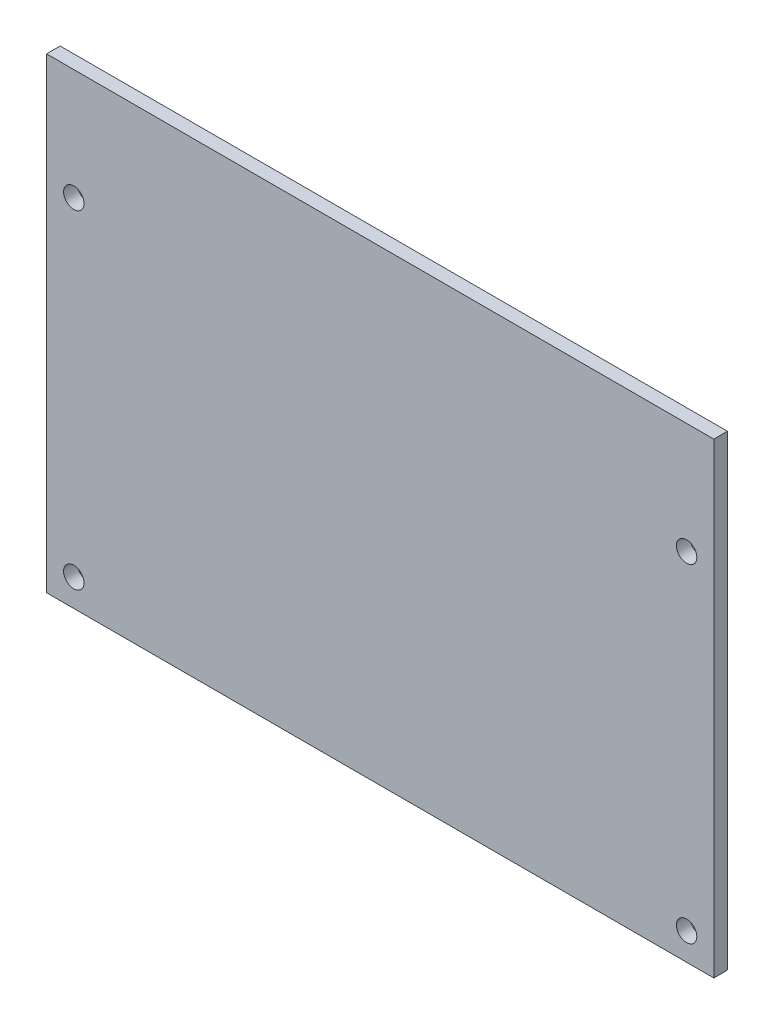
ISO-10303-21;
HEADER;
FILE_DESCRIPTION(('STEP AP214'),'2;1');
FILE_NAME('part.step','',(''),(''),'','','');
FILE_SCHEMA(('AUTOMOTIVE_DESIGN { 1 0 10303 214 1 1 1 1 }'));
ENDSEC;
DATA;
#1=APPLICATION_CONTEXT('core data for automotive mechanical design processes');
#2=APPLICATION_PROTOCOL_DEFINITION('international standard','automotive_design',2000,#1);
#3=PRODUCT_CONTEXT('',#1,'mechanical');
#4=PRODUCT('Part','Part','',(#3));
#5=PRODUCT_RELATED_PRODUCT_CATEGORY('part','',(#4));
#6=PRODUCT_DEFINITION_FORMATION('','',#4);
#7=PRODUCT_DEFINITION_CONTEXT('part definition',#1,'design');
#8=PRODUCT_DEFINITION('design','',#6,#7);
#9=PRODUCT_DEFINITION_SHAPE('','',#8);
#10=(LENGTH_UNIT() NAMED_UNIT(*) SI_UNIT(.MILLI.,.METRE.));
#11=(NAMED_UNIT(*) PLANE_ANGLE_UNIT() SI_UNIT($,.RADIAN.));
#12=(NAMED_UNIT(*) SI_UNIT($,.STERADIAN.) SOLID_ANGLE_UNIT());
#13=UNCERTAINTY_MEASURE_WITH_UNIT(LENGTH_MEASURE(1.E-05),#10,'distance_accuracy_value','');
#14=(GEOMETRIC_REPRESENTATION_CONTEXT(3) GLOBAL_UNCERTAINTY_ASSIGNED_CONTEXT((#13)) GLOBAL_UNIT_ASSIGNED_CONTEXT((#10,
#11,#12)) REPRESENTATION_CONTEXT('',''));
#15=CARTESIAN_POINT('',(0.,0.,0.));
#16=DIRECTION('',(0.,0.,1.));
#17=DIRECTION('',(1.,0.,0.));
#18=AXIS2_PLACEMENT_3D('',#15,#16,#17);
#19=CARTESIAN_POINT('',(0.,0.,2.));
#20=DIRECTION('',(0.,0.,1.));
#21=DIRECTION('',(1.,0.,0.));
#22=AXIS2_PLACEMENT_3D('',#19,#20,#21);
#23=PLANE('',#22);
#24=CARTESIAN_POINT('',(32.7671798801061,-22.854174200445,2.));
#25=DIRECTION('',(0.,0.,1.));
#26=DIRECTION('',(1.,0.,0.));
#27=AXIS2_PLACEMENT_3D('',#24,#25,#26);
#28=CIRCLE('',#27,1.5);
#29=CARTESIAN_POINT('',(34.2671798801061,-22.854174200445,2.));
#30=VERTEX_POINT('',#29);
#31=EDGE_CURVE('E120',#30,#30,#28,.T.);
#32=ORIENTED_EDGE('',*,*,#31,.F.);
#33=EDGE_LOOP('',(#32));
#34=FACE_BOUND('',#33,.T.);
#35=CARTESIAN_POINT('',(-57.2328201198939,25.395825799555,2.));
#36=DIRECTION('',(0.,0.,1.));
#37=DIRECTION('',(1.,0.,0.));
#38=AXIS2_PLACEMENT_3D('',#35,#36,#37);
#39=CIRCLE('',#38,1.5);
#40=CARTESIAN_POINT('',(-55.7328201198939,25.395825799555,2.));
#41=VERTEX_POINT('',#40);
#42=EDGE_CURVE('E99',#41,#41,#39,.T.);
#43=ORIENTED_EDGE('',*,*,#42,.F.);
#44=EDGE_LOOP('',(#43));
#45=FACE_BOUND('',#44,.T.);
#46=DIRECTION('',(0.,1.,0.));
#47=VECTOR('',#46,1.);
#48=CARTESIAN_POINT('',(36.7671798801061,41.6881443298969,2.));
#49=LINE('',#48,#47);
#50=CARTESIAN_POINT('',(36.7671798801061,-26.854174200445,2.));
#51=VERTEX_POINT('',#50);
#52=CARTESIAN_POINT('',(36.7671798801061,41.6881443298969,2.));
#53=VERTEX_POINT('',#52);
#54=EDGE_CURVE('E84',#51,#53,#49,.T.);
#55=ORIENTED_EDGE('',*,*,#54,.T.);
#56=DIRECTION('',(-1.,0.,0.));
#57=VECTOR('',#56,1.);
#58=CARTESIAN_POINT('',(-61.2328201198939,41.6881443298969,2.));
#59=LINE('',#58,#57);
#60=CARTESIAN_POINT('',(-61.2328201198939,41.6881443298969,2.));
#61=VERTEX_POINT('',#60);
#62=EDGE_CURVE('E79',#53,#61,#59,.T.);
#63=ORIENTED_EDGE('',*,*,#62,.T.);
#64=DIRECTION('',(0.,-1.,0.));
#65=VECTOR('',#64,1.);
#66=CARTESIAN_POINT('',(-61.2328201198939,41.6881443298969,2.));
#67=LINE('',#66,#65);
#68=CARTESIAN_POINT('',(-61.2328201198939,-26.854174200445,2.));
#69=VERTEX_POINT('',#68);
#70=EDGE_CURVE('E82',#61,#69,#67,.T.);
#71=ORIENTED_EDGE('',*,*,#70,.T.);
#72=DIRECTION('',(1.,0.,0.));
#73=VECTOR('',#72,1.);
#74=CARTESIAN_POINT('',(-61.2328201198939,-26.854174200445,2.));
#75=LINE('',#74,#73);
#76=EDGE_CURVE('E49',#69,#51,#75,.T.);
#77=ORIENTED_EDGE('',*,*,#76,.T.);
#78=EDGE_LOOP('',(#55,#63,#71,#77));
#79=FACE_BOUND('',#78,.T.);
#80=CARTESIAN_POINT('',(-57.2328201198939,-22.854174200445,2.));
#81=DIRECTION('',(0.,0.,1.));
#82=DIRECTION('',(1.,0.,0.));
#83=AXIS2_PLACEMENT_3D('',#80,#81,#82);
#84=CIRCLE('',#83,1.5);
#85=CARTESIAN_POINT('',(-55.7328201198939,-22.854174200445,2.));
#86=VERTEX_POINT('',#85);
#87=EDGE_CURVE('E114',#86,#86,#84,.T.);
#88=ORIENTED_EDGE('',*,*,#87,.F.);
#89=EDGE_LOOP('',(#88));
#90=FACE_BOUND('',#89,.T.);
#91=CARTESIAN_POINT('',(32.7671798801061,25.3958257995551,2.));
#92=DIRECTION('',(0.,0.,1.));
#93=DIRECTION('',(1.,0.,0.));
#94=AXIS2_PLACEMENT_3D('',#91,#92,#93);
#95=CIRCLE('',#94,1.5);
#96=CARTESIAN_POINT('',(34.2671798801061,25.3958257995551,2.));
#97=VERTEX_POINT('',#96);
#98=EDGE_CURVE('E126',#97,#97,#95,.T.);
#99=ORIENTED_EDGE('',*,*,#98,.F.);
#100=EDGE_LOOP('',(#99));
#101=FACE_BOUND('',#100,.T.);
#102=ADVANCED_FACE('F32',(#34,#45,#79,#90,#101),#23,.T.);
#103=CARTESIAN_POINT('',(0.,0.,0.));
#104=DIRECTION('',(0.,0.,1.));
#105=DIRECTION('',(1.,0.,0.));
#106=AXIS2_PLACEMENT_3D('',#103,#104,#105);
#107=PLANE('',#106);
#108=DIRECTION('',(0.,1.,0.));
#109=VECTOR('',#108,1.);
#110=CARTESIAN_POINT('',(36.7671798801061,41.6881443298969,0.));
#111=LINE('',#110,#109);
#112=CARTESIAN_POINT('',(36.7671798801061,-26.854174200445,0.));
#113=VERTEX_POINT('',#112);
#114=CARTESIAN_POINT('',(36.7671798801061,41.6881443298969,0.));
#115=VERTEX_POINT('',#114);
#116=EDGE_CURVE('E96',#113,#115,#111,.T.);
#117=ORIENTED_EDGE('',*,*,#116,.F.);
#118=DIRECTION('',(1.,0.,0.));
#119=VECTOR('',#118,1.);
#120=CARTESIAN_POINT('',(-61.2328201198939,-26.854174200445,0.));
#121=LINE('',#120,#119);
#122=CARTESIAN_POINT('',(-61.2328201198939,-26.854174200445,0.));
#123=VERTEX_POINT('',#122);
#124=EDGE_CURVE('E72',#123,#113,#121,.T.);
#125=ORIENTED_EDGE('',*,*,#124,.F.);
#126=DIRECTION('',(0.,-1.,0.));
#127=VECTOR('',#126,1.);
#128=CARTESIAN_POINT('',(-61.2328201198939,41.6881443298969,0.));
#129=LINE('',#128,#127);
#130=CARTESIAN_POINT('',(-61.2328201198939,41.6881443298969,0.));
#131=VERTEX_POINT('',#130);
#132=EDGE_CURVE('E66',#131,#123,#129,.T.);
#133=ORIENTED_EDGE('',*,*,#132,.F.);
#134=DIRECTION('',(-1.,0.,0.));
#135=VECTOR('',#134,1.);
#136=CARTESIAN_POINT('',(-61.2328201198939,41.6881443298969,0.));
#137=LINE('',#136,#135);
#138=EDGE_CURVE('E88',#115,#131,#137,.T.);
#139=ORIENTED_EDGE('',*,*,#138,.F.);
#140=EDGE_LOOP('',(#117,#125,#133,#139));
#141=FACE_BOUND('',#140,.T.);
#142=CARTESIAN_POINT('',(-57.2328201198939,25.395825799555,0.));
#143=DIRECTION('',(0.,0.,1.));
#144=DIRECTION('',(1.,0.,0.));
#145=AXIS2_PLACEMENT_3D('',#142,#143,#144);
#146=CIRCLE('',#145,1.5);
#147=CARTESIAN_POINT('',(-55.7328201198939,25.395825799555,0.));
#148=VERTEX_POINT('',#147);
#149=EDGE_CURVE('E111',#148,#148,#146,.T.);
#150=ORIENTED_EDGE('',*,*,#149,.T.);
#151=EDGE_LOOP('',(#150));
#152=FACE_BOUND('',#151,.T.);
#153=CARTESIAN_POINT('',(-57.2328201198939,-22.854174200445,0.));
#154=DIRECTION('',(0.,0.,1.));
#155=DIRECTION('',(1.,0.,0.));
#156=AXIS2_PLACEMENT_3D('',#153,#154,#155);
#157=CIRCLE('',#156,1.5);
#158=CARTESIAN_POINT('',(-55.7328201198939,-22.854174200445,0.));
#159=VERTEX_POINT('',#158);
#160=EDGE_CURVE('E117',#159,#159,#157,.T.);
#161=ORIENTED_EDGE('',*,*,#160,.T.);
#162=EDGE_LOOP('',(#161));
#163=FACE_BOUND('',#162,.T.);
#164=CARTESIAN_POINT('',(32.7671798801061,-22.854174200445,0.));
#165=DIRECTION('',(0.,0.,1.));
#166=DIRECTION('',(1.,0.,0.));
#167=AXIS2_PLACEMENT_3D('',#164,#165,#166);
#168=CIRCLE('',#167,1.5);
#169=CARTESIAN_POINT('',(34.2671798801061,-22.854174200445,0.));
#170=VERTEX_POINT('',#169);
#171=EDGE_CURVE('E123',#170,#170,#168,.T.);
#172=ORIENTED_EDGE('',*,*,#171,.T.);
#173=EDGE_LOOP('',(#172));
#174=FACE_BOUND('',#173,.T.);
#175=CARTESIAN_POINT('',(32.7671798801061,25.3958257995551,0.));
#176=DIRECTION('',(0.,0.,1.));
#177=DIRECTION('',(1.,0.,0.));
#178=AXIS2_PLACEMENT_3D('',#175,#176,#177);
#179=CIRCLE('',#178,1.5);
#180=CARTESIAN_POINT('',(34.2671798801061,25.3958257995551,0.));
#181=VERTEX_POINT('',#180);
#182=EDGE_CURVE('E129',#181,#181,#179,.T.);
#183=ORIENTED_EDGE('',*,*,#182,.T.);
#184=EDGE_LOOP('',(#183));
#185=FACE_BOUND('',#184,.T.);
#186=ADVANCED_FACE('F107',(#141,#152,#163,#174,#185),#107,.F.);
#187=CARTESIAN_POINT('',(36.7671798801061,41.6881443298969,2.));
#188=DIRECTION('',(-1.,0.,0.));
#189=DIRECTION('',(0.,-1.,0.));
#190=AXIS2_PLACEMENT_3D('',#187,#188,#189);
#191=PLANE('',#190);
#192=ORIENTED_EDGE('',*,*,#116,.T.);
#193=DIRECTION('',(0.,0.,-1.));
#194=VECTOR('',#193,1.);
#195=CARTESIAN_POINT('',(36.7671798801061,41.6881443298969,2.));
#196=LINE('',#195,#194);
#197=EDGE_CURVE('E11',#53,#115,#196,.T.);
#198=ORIENTED_EDGE('',*,*,#197,.F.);
#199=ORIENTED_EDGE('',*,*,#54,.F.);
#200=DIRECTION('',(0.,0.,-1.));
#201=VECTOR('',#200,1.);
#202=CARTESIAN_POINT('',(36.7671798801061,-26.854174200445,2.));
#203=LINE('',#202,#201);
#204=EDGE_CURVE('E92',#51,#113,#203,.T.);
#205=ORIENTED_EDGE('',*,*,#204,.T.);
#206=EDGE_LOOP('',(#192,#198,#199,#205));
#207=FACE_BOUND('',#206,.T.);
#208=ADVANCED_FACE('F34',(#207),#191,.F.);
#209=CARTESIAN_POINT('',(-61.2328201198939,41.6881443298969,2.));
#210=DIRECTION('',(0.,-1.,0.));
#211=DIRECTION('',(0.,0.,-1.));
#212=AXIS2_PLACEMENT_3D('',#209,#210,#211);
#213=PLANE('',#212);
#214=ORIENTED_EDGE('',*,*,#138,.T.);
#215=DIRECTION('',(0.,0.,-1.));
#216=VECTOR('',#215,1.);
#217=CARTESIAN_POINT('',(-61.2328201198939,41.6881443298969,2.));
#218=LINE('',#217,#216);
#219=EDGE_CURVE('E41',#61,#131,#218,.T.);
#220=ORIENTED_EDGE('',*,*,#219,.F.);
#221=ORIENTED_EDGE('',*,*,#62,.F.);
#222=ORIENTED_EDGE('',*,*,#197,.T.);
#223=EDGE_LOOP('',(#214,#220,#221,#222));
#224=FACE_BOUND('',#223,.T.);
#225=ADVANCED_FACE('F87',(#224),#213,.F.);
#226=CARTESIAN_POINT('',(-61.2328201198939,41.6881443298969,2.));
#227=DIRECTION('',(1.,0.,0.));
#228=DIRECTION('',(0.,1.,0.));
#229=AXIS2_PLACEMENT_3D('',#226,#227,#228);
#230=PLANE('',#229);
#231=ORIENTED_EDGE('',*,*,#132,.T.);
#232=DIRECTION('',(0.,0.,-1.));
#233=VECTOR('',#232,1.);
#234=CARTESIAN_POINT('',(-61.2328201198939,-26.854174200445,2.));
#235=LINE('',#234,#233);
#236=EDGE_CURVE('E89',#69,#123,#235,.T.);
#237=ORIENTED_EDGE('',*,*,#236,.F.);
#238=ORIENTED_EDGE('',*,*,#70,.F.);
#239=ORIENTED_EDGE('',*,*,#219,.T.);
#240=EDGE_LOOP('',(#231,#237,#238,#239));
#241=FACE_BOUND('',#240,.T.);
#242=ADVANCED_FACE('F90',(#241),#230,.F.);
#243=CARTESIAN_POINT('',(-61.2328201198939,-26.854174200445,2.));
#244=DIRECTION('',(0.,1.,0.));
#245=DIRECTION('',(0.,0.,1.));
#246=AXIS2_PLACEMENT_3D('',#243,#244,#245);
#247=PLANE('',#246);
#248=ORIENTED_EDGE('',*,*,#124,.T.);
#249=ORIENTED_EDGE('',*,*,#204,.F.);
#250=ORIENTED_EDGE('',*,*,#76,.F.);
#251=ORIENTED_EDGE('',*,*,#236,.T.);
#252=EDGE_LOOP('',(#248,#249,#250,#251));
#253=FACE_BOUND('',#252,.T.);
#254=ADVANCED_FACE('F104',(#253),#247,.F.);
#255=CARTESIAN_POINT('',(-57.2328201198939,25.395825799555,2.));
#256=DIRECTION('',(0.,0.,-1.));
#257=DIRECTION('',(-1.,0.,0.));
#258=AXIS2_PLACEMENT_3D('',#255,#256,#257);
#259=CYLINDRICAL_SURFACE('',#258,1.5);
#260=ORIENTED_EDGE('',*,*,#42,.T.);
#261=EDGE_LOOP('',(#260));
#262=FACE_BOUND('',#261,.T.);
#263=ORIENTED_EDGE('',*,*,#149,.F.);
#264=EDGE_LOOP('',(#263));
#265=FACE_BOUND('',#264,.T.);
#266=ADVANCED_FACE('F148',(#262,#265),#259,.F.);
#267=CARTESIAN_POINT('',(-57.2328201198939,-22.854174200445,2.));
#268=DIRECTION('',(0.,0.,-1.));
#269=DIRECTION('',(-1.,0.,0.));
#270=AXIS2_PLACEMENT_3D('',#267,#268,#269);
#271=CYLINDRICAL_SURFACE('',#270,1.5);
#272=ORIENTED_EDGE('',*,*,#87,.T.);
#273=EDGE_LOOP('',(#272));
#274=FACE_BOUND('',#273,.T.);
#275=ORIENTED_EDGE('',*,*,#160,.F.);
#276=EDGE_LOOP('',(#275));
#277=FACE_BOUND('',#276,.T.);
#278=ADVANCED_FACE('F194',(#274,#277),#271,.F.);
#279=CARTESIAN_POINT('',(32.7671798801061,-22.854174200445,2.));
#280=DIRECTION('',(0.,0.,-1.));
#281=DIRECTION('',(-1.,0.,0.));
#282=AXIS2_PLACEMENT_3D('',#279,#280,#281);
#283=CYLINDRICAL_SURFACE('',#282,1.5);
#284=ORIENTED_EDGE('',*,*,#31,.T.);
#285=EDGE_LOOP('',(#284));
#286=FACE_BOUND('',#285,.T.);
#287=ORIENTED_EDGE('',*,*,#171,.F.);
#288=EDGE_LOOP('',(#287));
#289=FACE_BOUND('',#288,.T.);
#290=ADVANCED_FACE('F202',(#286,#289),#283,.F.);
#291=CARTESIAN_POINT('',(32.7671798801061,25.3958257995551,2.));
#292=DIRECTION('',(0.,0.,-1.));
#293=DIRECTION('',(-1.,0.,0.));
#294=AXIS2_PLACEMENT_3D('',#291,#292,#293);
#295=CYLINDRICAL_SURFACE('',#294,1.5);
#296=ORIENTED_EDGE('',*,*,#98,.T.);
#297=EDGE_LOOP('',(#296));
#298=FACE_BOUND('',#297,.T.);
#299=ORIENTED_EDGE('',*,*,#182,.F.);
#300=EDGE_LOOP('',(#299));
#301=FACE_BOUND('',#300,.T.);
#302=ADVANCED_FACE('F135',(#298,#301),#295,.F.);
#303=CLOSED_SHELL('',(#102,#186,#208,#225,#242,#254,#266,#278,#290,#302));
#304=MANIFOLD_SOLID_BREP('B2',#303);
#305=ADVANCED_BREP_SHAPE_REPRESENTATION('',(#18,#304),#14);
#306=SHAPE_DEFINITION_REPRESENTATION(#9,#305);
ENDSEC;
END-ISO-10303-21;
